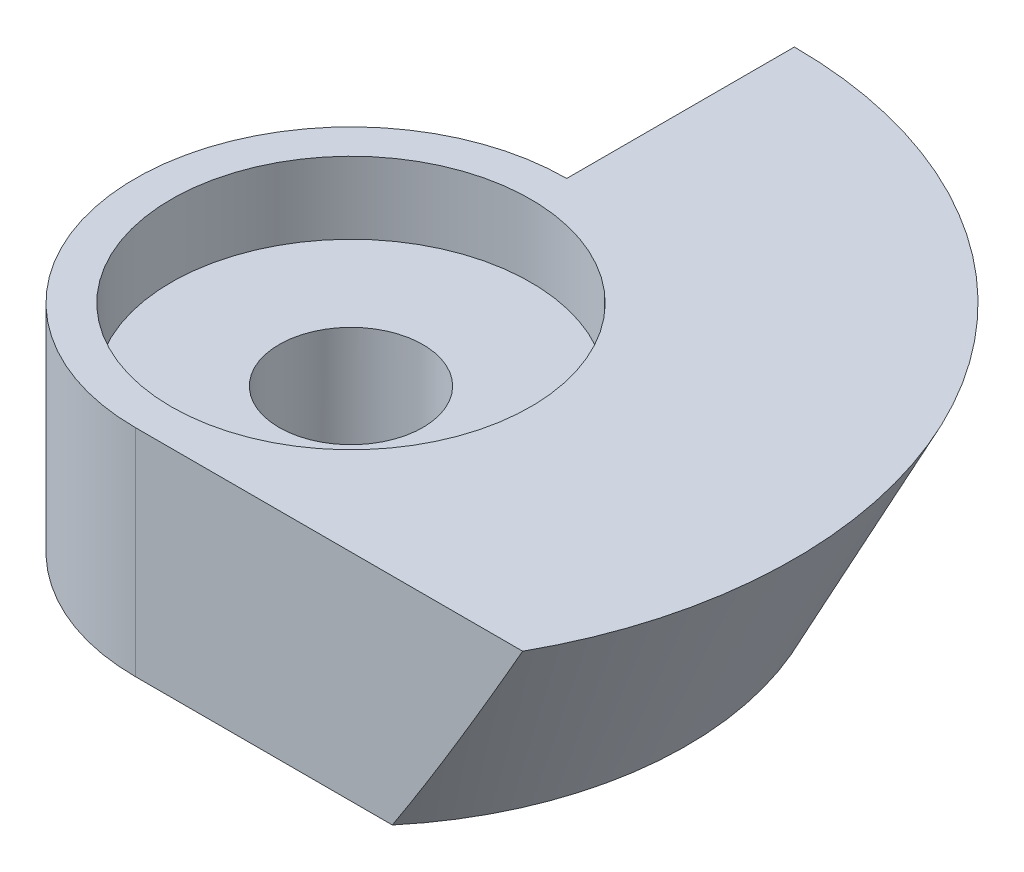
ISO-10303-21;
HEADER;
FILE_DESCRIPTION(('STEP AP214'),'2;1');
FILE_NAME('part.step','',(''),(''),'','','');
FILE_SCHEMA(('AUTOMOTIVE_DESIGN { 1 0 10303 214 1 1 1 1 }'));
ENDSEC;
DATA;
#1=APPLICATION_CONTEXT('core data for automotive mechanical design processes');
#2=APPLICATION_PROTOCOL_DEFINITION('international standard','automotive_design',2000,#1);
#3=PRODUCT_CONTEXT('',#1,'mechanical');
#4=PRODUCT('Part','Part','',(#3));
#5=PRODUCT_RELATED_PRODUCT_CATEGORY('part','',(#4));
#6=PRODUCT_DEFINITION_FORMATION('','',#4);
#7=PRODUCT_DEFINITION_CONTEXT('part definition',#1,'design');
#8=PRODUCT_DEFINITION('design','',#6,#7);
#9=PRODUCT_DEFINITION_SHAPE('','',#8);
#10=(LENGTH_UNIT() NAMED_UNIT(*) SI_UNIT(.MILLI.,.METRE.));
#11=(NAMED_UNIT(*) PLANE_ANGLE_UNIT() SI_UNIT($,.RADIAN.));
#12=(NAMED_UNIT(*) SI_UNIT($,.STERADIAN.) SOLID_ANGLE_UNIT());
#13=UNCERTAINTY_MEASURE_WITH_UNIT(LENGTH_MEASURE(1.E-05),#10,'distance_accuracy_value','');
#14=(GEOMETRIC_REPRESENTATION_CONTEXT(3) GLOBAL_UNCERTAINTY_ASSIGNED_CONTEXT((#13)) GLOBAL_UNIT_ASSIGNED_CONTEXT((#10,
#11,#12)) REPRESENTATION_CONTEXT('',''));
#15=CARTESIAN_POINT('',(0.,0.,0.));
#16=DIRECTION('',(0.,0.,1.));
#17=DIRECTION('',(1.,0.,0.));
#18=AXIS2_PLACEMENT_3D('',#15,#16,#17);
#19=CARTESIAN_POINT('',(-34.,-2.,0.));
#20=DIRECTION('',(0.,1.,0.));
#21=DIRECTION('',(0.,0.,1.));
#22=AXIS2_PLACEMENT_3D('',#19,#20,#21);
#23=CYLINDRICAL_SURFACE('',#22,3.);
#24=CARTESIAN_POINT('',(-34.,0.,0.));
#25=DIRECTION('',(0.,-1.,0.));
#26=DIRECTION('',(0.,0.,-1.));
#27=AXIS2_PLACEMENT_3D('',#24,#25,#26);
#28=CIRCLE('',#27,3.);
#29=CARTESIAN_POINT('',(-34.,0.,-3.));
#30=VERTEX_POINT('',#29);
#31=EDGE_CURVE('E90',#30,#30,#28,.T.);
#32=ORIENTED_EDGE('',*,*,#31,.T.);
#33=EDGE_LOOP('',(#32));
#34=FACE_BOUND('',#33,.T.);
#35=CARTESIAN_POINT('',(-34.,6.,0.));
#36=DIRECTION('',(0.,1.,0.));
#37=DIRECTION('',(0.,0.,1.));
#38=AXIS2_PLACEMENT_3D('',#35,#36,#37);
#39=CIRCLE('',#38,3.);
#40=CARTESIAN_POINT('',(-34.,6.,3.));
#41=VERTEX_POINT('',#40);
#42=EDGE_CURVE('E37',#41,#41,#39,.F.);
#43=ORIENTED_EDGE('',*,*,#42,.F.);
#44=EDGE_LOOP('',(#43));
#45=FACE_BOUND('',#44,.T.);
#46=ADVANCED_FACE('F33',(#34,#45),#23,.F.);
#47=CARTESIAN_POINT('',(-34.,0.,0.));
#48=DIRECTION('',(0.,-1.,0.));
#49=DIRECTION('',(0.,0.,-1.));
#50=AXIS2_PLACEMENT_3D('',#47,#48,#49);
#51=PLANE('',#50);
#52=ORIENTED_EDGE('',*,*,#31,.F.);
#53=EDGE_LOOP('',(#52));
#54=FACE_BOUND('',#53,.T.);
#55=DIRECTION('',(1.,0.,0.));
#56=VECTOR('',#55,1.);
#57=CARTESIAN_POINT('',(-34.,0.,9.00000000000001));
#58=LINE('',#57,#56);
#59=CARTESIAN_POINT('',(-34.,0.,9.00000000000001));
#60=VERTEX_POINT('',#59);
#61=CARTESIAN_POINT('',(-23.2761947052364,0.,9.00000000000001));
#62=VERTEX_POINT('',#61);
#63=EDGE_CURVE('E57',#60,#62,#58,.T.);
#64=ORIENTED_EDGE('',*,*,#63,.F.);
#65=CARTESIAN_POINT('',(-34.,0.,0.));
#66=DIRECTION('',(0.,-1.,0.));
#67=DIRECTION('',(0.,0.,-1.));
#68=AXIS2_PLACEMENT_3D('',#65,#66,#67);
#69=CIRCLE('',#68,9.);
#70=CARTESIAN_POINT('',(-34.,0.,-9.));
#71=VERTEX_POINT('',#70);
#72=EDGE_CURVE('E77',#71,#60,#69,.F.);
#73=ORIENTED_EDGE('',*,*,#72,.F.);
#74=DIRECTION('',(0.,0.,1.));
#75=VECTOR('',#74,1.);
#76=CARTESIAN_POINT('',(-34.,0.,0.));
#77=LINE('',#76,#75);
#78=CARTESIAN_POINT('',(-34.,0.,-14.));
#79=VERTEX_POINT('',#78);
#80=EDGE_CURVE('E99',#79,#71,#77,.T.);
#81=ORIENTED_EDGE('',*,*,#80,.F.);
#82=CARTESIAN_POINT('',(-34.,0.,0.));
#83=DIRECTION('',(0.,-1.,0.));
#84=DIRECTION('',(0.,0.,-1.));
#85=AXIS2_PLACEMENT_3D('',#82,#83,#84);
#86=CIRCLE('',#85,14.);
#87=EDGE_CURVE('E42',#79,#62,#86,.T.);
#88=ORIENTED_EDGE('',*,*,#87,.T.);
#89=EDGE_LOOP('',(#64,#73,#81,#88));
#90=FACE_BOUND('',#89,.T.);
#91=ADVANCED_FACE('F35',(#54,#90),#51,.T.);
#92=CARTESIAN_POINT('',(-34.,0.,0.));
#93=DIRECTION('',(0.,1.,0.));
#94=DIRECTION('',(0.,0.,1.));
#95=AXIS2_PLACEMENT_3D('',#92,#93,#94);
#96=CONICAL_SURFACE('',#95,14.,0.463647609000806);
#97=CARTESIAN_POINT('',(-46.05124263342,2.082051061027,9.00000000000001));
#98=CARTESIAN_POINT('',(-45.8418051737676,1.74647778440443,9.00000000000001));
#99=CARTESIAN_POINT('',(-45.6309921241656,1.41175580696632,9.00000000000001));
#100=CARTESIAN_POINT('',(-45.2061097794136,0.744352153815646,9.00000000000001));
#101=CARTESIAN_POINT('',(-44.9920402502802,0.411670627145565,9.00000000000001));
#102=CARTESIAN_POINT('',(-44.5595931486075,-0.252151320341726,9.00000000000001));
#103=CARTESIAN_POINT('',(-44.3412055955063,-0.583285250384705,9.00000000000001));
#104=CARTESIAN_POINT('',(-43.9000476576624,-1.2426126988821,9.00000000000001));
#105=CARTESIAN_POINT('',(-43.6772773819428,-1.57080629018444,9.00000000000001));
#106=CARTESIAN_POINT('',(-43.2118706895413,-2.24491219360758,9.00000000000001));
#107=CARTESIAN_POINT('',(-42.968885982482,-2.59058466598029,9.00000000000001));
#108=CARTESIAN_POINT('',(-42.4758451150317,-3.27684536002181,9.00000000000001));
#109=CARTESIAN_POINT('',(-42.2257891995151,-3.6174337571286,9.00000000000001));
#110=CARTESIAN_POINT('',(-41.7173181348371,-4.29170758895674,9.00000000000001));
#111=CARTESIAN_POINT('',(-41.4589132712517,-4.62540074499735,9.00000000000001));
#112=CARTESIAN_POINT('',(-40.931418565917,-5.2841815825682,9.00000000000001));
#113=CARTESIAN_POINT('',(-40.6623304023776,-5.60927060243106,9.00000000000001));
#114=CARTESIAN_POINT('',(-40.114252574345,-6.24365394102159,9.00000000000001));
#115=CARTESIAN_POINT('',(-39.8354410268634,-6.55310033119076,9.00000000000001));
#116=CARTESIAN_POINT('',(-39.404424670339,-7.00543598789603,9.00000000000001));
#117=CARTESIAN_POINT('',(-39.2585219489401,-7.15433366601658,9.00000000000001));
#118=CARTESIAN_POINT('',(-38.9618976077592,-7.44726173113909,9.00000000000001));
#119=CARTESIAN_POINT('',(-38.8111761378386,-7.59129226922149,9.00000000000001));
#120=CARTESIAN_POINT('',(-38.5064692191541,-7.87139104368516,9.00000000000001));
#121=CARTESIAN_POINT('',(-38.3525620058534,-8.00754406128876,9.00000000000001));
#122=CARTESIAN_POINT('',(-38.0386942313773,-8.27277914074999,9.00000000000001));
#123=CARTESIAN_POINT('',(-37.8787326894771,-8.40186004865441,9.00000000000001));
#124=CARTESIAN_POINT('',(-37.5523766433106,-8.65092511753133,9.00000000000001));
#125=CARTESIAN_POINT('',(-37.3859965320914,-8.77092802702211,9.00000000000001));
#126=CARTESIAN_POINT('',(-37.0458230584429,-8.99985261237219,9.00000000000001));
#127=CARTESIAN_POINT('',(-36.8720335963641,-9.10878001870419,9.00000000000001));
#128=CARTESIAN_POINT('',(-36.5605749181766,-9.28742021918038,9.00000000000001));
#129=CARTESIAN_POINT('',(-36.4246438377588,-9.36015663216481,9.00000000000001));
#130=CARTESIAN_POINT('',(-36.1481449410307,-9.49631649116809,9.00000000000001));
#131=CARTESIAN_POINT('',(-36.0075768473842,-9.55973937891067,9.00000000000001));
#132=CARTESIAN_POINT('',(-35.7222265773906,-9.67552569790647,9.00000000000001));
#133=CARTESIAN_POINT('',(-35.5774527298446,-9.72790949015109,9.00000000000001));
#134=CARTESIAN_POINT('',(-35.2839550681397,-9.8200587659661,9.00000000000001));
#135=CARTESIAN_POINT('',(-35.135232826158,-9.85982919264216,9.00000000000001));
#136=CARTESIAN_POINT('',(-34.858073338951,-9.92013589673058,9.00000000000001));
#137=CARTESIAN_POINT('',(-34.7300777624977,-9.94270138445147,9.00000000000001));
#138=CARTESIAN_POINT('',(-34.4726423367027,-9.97702502264165,9.00000000000001));
#139=CARTESIAN_POINT('',(-34.3432026467076,-9.98878435377838,9.00000000000001));
#140=CARTESIAN_POINT('',(-34.08372369976,-10.0010911758163,9.00000000000001));
#141=CARTESIAN_POINT('',(-33.9536841803814,-10.0016331768157,9.00000000000001));
#142=CARTESIAN_POINT('',(-33.6940448817707,-9.99147332689007,9.00000000000001));
#143=CARTESIAN_POINT('',(-33.5644451201461,-9.98077103095955,9.00000000000001));
#144=CARTESIAN_POINT('',(-33.3070921385899,-9.94855235077597,9.00000000000001));
#145=CARTESIAN_POINT('',(-33.1793338627076,-9.92707610022198,9.00000000000001));
#146=CARTESIAN_POINT('',(-32.92591243172,-9.87402382913864,9.00000000000001));
#147=CARTESIAN_POINT('',(-32.8002501590582,-9.84244366229594,9.00000000000001));
#148=CARTESIAN_POINT('',(-32.4274307710317,-9.73389498537744,9.00000000000001));
#149=CARTESIAN_POINT('',(-32.1842312903593,-9.64308961834335,9.00000000000001));
#150=CARTESIAN_POINT('',(-31.7393795275111,-9.44532728846524,9.00000000000001));
#151=CARTESIAN_POINT('',(-31.5362359760544,-9.3415986973749,9.00000000000001));
#152=CARTESIAN_POINT('',(-31.1397306932985,-9.11667353735228,9.00000000000001));
#153=CARTESIAN_POINT('',(-30.946377074036,-8.99546279250116,9.00000000000001));
#154=CARTESIAN_POINT('',(-30.5680181776564,-8.73898779165434,9.00000000000001));
#155=CARTESIAN_POINT('',(-30.3830556924628,-8.60366107368573,9.00000000000001));
#156=CARTESIAN_POINT('',(-30.1118748855732,-8.39279654805537,9.00000000000001));
#157=CARTESIAN_POINT('',(-30.0225402243289,-8.32120921167293,9.00000000000001));
#158=CARTESIAN_POINT('',(-29.8458050706926,-8.17568669573227,9.00000000000001));
#159=CARTESIAN_POINT('',(-29.7584045472328,-8.10175155393304,9.00000000000001));
#160=CARTESIAN_POINT('',(-29.490130426298,-7.86922254446967,9.00000000000001));
#161=CARTESIAN_POINT('',(-29.3123299217795,-7.7070752100221,9.00000000000001));
#162=CARTESIAN_POINT('',(-28.9635775339928,-7.37554580216417,9.00000000000001));
#163=CARTESIAN_POINT('',(-28.7926274245331,-7.20616187810628,9.00000000000001));
#164=CARTESIAN_POINT('',(-28.4565209727252,-6.86147304778311,9.00000000000001));
#165=CARTESIAN_POINT('',(-28.2913697499922,-6.68616316500284,9.00000000000001));
#166=CARTESIAN_POINT('',(-27.9662000717485,-6.33083245006463,9.00000000000001));
#167=CARTESIAN_POINT('',(-27.8061821031208,-6.1508111739599,9.00000000000001));
#168=CARTESIAN_POINT('',(-27.4900653862954,-5.7862643821218,9.00000000000001));
#169=CARTESIAN_POINT('',(-27.3339823017993,-5.60172531568982,9.00000000000001));
#170=CARTESIAN_POINT('',(-27.0257448586162,-5.22938967972377,9.00000000000001));
#171=CARTESIAN_POINT('',(-26.873590677661,-5.04159296346356,9.00000000000001));
#172=CARTESIAN_POINT('',(-26.4224397967054,-4.47430717975398,9.00000000000001));
#173=CARTESIAN_POINT('',(-26.1285859494027,-4.09072534023988,9.00000000000001));
#174=CARTESIAN_POINT('',(-25.5479707804581,-3.31072339664814,9.00000000000001));
#175=CARTESIAN_POINT('',(-25.2613462082285,-2.91420226901157,9.00000000000001));
#176=CARTESIAN_POINT('',(-24.6968392806286,-2.11494053456859,9.00000000000001));
#177=CARTESIAN_POINT('',(-24.4189578265672,-1.71219929288303,9.00000000000001));
#178=CARTESIAN_POINT('',(-23.8709127643292,-0.902814015668781,9.00000000000001));
#179=CARTESIAN_POINT('',(-23.6007334264781,-0.496180599009647,9.00000000000001));
#180=CARTESIAN_POINT('',(-23.0662125743692,0.320877389166775,9.00000000000001));
#181=CARTESIAN_POINT('',(-22.8018708544045,0.731301826370288,9.00000000000001));
#182=CARTESIAN_POINT('',(-22.2774251541367,1.55621557914998,9.00000000000001));
#183=CARTESIAN_POINT('',(-22.017332744564,1.97071223955201,9.00000000000001));
#184=CARTESIAN_POINT('',(-21.5012714478924,2.80226664694878,9.00000000000001));
#185=CARTESIAN_POINT('',(-21.2453026031377,3.21932442018247,9.00000000000001));
#186=CARTESIAN_POINT('',(-20.4826162779848,4.47372003268317,9.00000000000001));
#187=CARTESIAN_POINT('',(-19.9811409275276,5.31424543267345,9.00000000000001));
#188=CARTESIAN_POINT('',(-18.9880654528852,7.0022819589798,9.00000000000001));
#189=CARTESIAN_POINT('',(-18.4964763400686,7.84979953631449,9.00000000000001));
#190=CARTESIAN_POINT('',(-17.5213099173667,9.54943740392245,9.00000000000001));
#191=CARTESIAN_POINT('',(-17.0377326914861,10.4015577423316,9.00000000000001));
#192=CARTESIAN_POINT('',(-16.100445663777,12.0674548468962,9.00000000000001));
#193=CARTESIAN_POINT('',(-15.6464343125674,12.8810622259291,9.00000000000001));
#194=CARTESIAN_POINT('',(-14.7430287560107,14.5108435745914,9.00000000000001));
#195=CARTESIAN_POINT('',(-14.2936345904027,15.3270175662322,9.00000000000001));
#196=CARTESIAN_POINT('',(-13.3992976545786,16.9602343141236,9.00000000000001));
#197=CARTESIAN_POINT('',(-12.9543492961203,17.7772740131035,9.00000000000001));
#198=CARTESIAN_POINT('',(-12.0676375485481,19.4130605656417,9.00000000000001));
#199=CARTESIAN_POINT('',(-11.6258740998917,20.231807386914,9.00000000000001));
#200=CARTESIAN_POINT('',(-11.1853971989285,21.0512426334199,9.00000000000001));
#201=B_SPLINE_CURVE_WITH_KNOTS('',3,(#97,#98,#99,#100,#101,#102,#103,#104,#105,#106,#107,#108,
#109,#110,#111,#112,#113,#114,#115,#116,#117,#118,#119,#120,#121,#122,#123,#124,#125,#126,#127,
#128,#129,#130,#131,#132,#133,#134,#135,#136,#137,#138,#139,#140,#141,#142,#143,#144,#145,#146,
#147,#148,#149,#150,#151,#152,#153,#154,#155,#156,#157,#158,#159,#160,#161,#162,#163,#164,#165,
#166,#167,#168,#169,#170,#171,#172,#173,#174,#175,#176,#177,#178,#179,#180,#181,#182,#183,#184,
#185,#186,#187,#188,#189,#190,#191,#192,#193,#194,#195,#196,#197,#198,#199,#200),.UNSPECIFIED.,
.F.,.F.,(4,2,2,2,2,2,2,2,2,2,2,2,2,2,2,2,2,2,2,2,2,2,2,2,2,2,2,2,2,2,2,2,2,2,2,2,2,2,2,2,2,2,2,
2,2,2,2,2,2,2,2,4),(0.,1.18670763549024,2.37350094436255,3.56346455379613,4.75339859947634,
6.02091332043228,7.2883842012246,8.55434905884636,9.82011583038283,11.0691349554468,
11.6944449852806,12.3197355870621,12.9360236023707,13.552411879473,14.1674902729323,
14.7822487874527,15.2444587315032,15.7066963702871,16.1680738276734,16.6292702498162,
17.0187533852593,17.4081939611904,17.7978251297068,18.1874717188877,18.5756775078576,
18.9640428084259,19.7401448551167,20.4234712859044,21.1073549601768,21.7944046244453,
22.1378090076447,22.481207870778,23.2028274148444,23.9246326199043,24.6470598271736,
25.3695553544148,26.094577638747,26.8196326636679,28.2689646208415,29.7366311994741,
31.2044485841882,32.6690152071413,34.1335301388274,35.6015273042044,37.0695395345858,
40.0056871911681,42.9449418412034,45.8842272898462,48.6793394303408,51.4744756075674,
54.2654888272467,57.0564497323441),.UNSPECIFIED.);
#202=CARTESIAN_POINT('',(-17.8367701247554,9.,9.00000000000001));
#203=VERTEX_POINT('',#202);
#204=EDGE_CURVE('E83',#62,#203,#201,.T.);
#205=ORIENTED_EDGE('',*,*,#204,.F.);
#206=ORIENTED_EDGE('',*,*,#87,.F.);
#207=DIRECTION('',(0.,0.894427190999916,-0.447213595499958));
#208=VECTOR('',#207,1.);
#209=CARTESIAN_POINT('',(-34.,-28.,0.));
#210=LINE('',#209,#208);
#211=CARTESIAN_POINT('',(-34.,9.,-18.5));
#212=VERTEX_POINT('',#211);
#213=EDGE_CURVE('E78',#212,#79,#210,.F.);
#214=ORIENTED_EDGE('',*,*,#213,.F.);
#215=CARTESIAN_POINT('',(-34.,9.,0.));
#216=DIRECTION('',(0.,-1.,0.));
#217=DIRECTION('',(0.,0.,-1.));
#218=AXIS2_PLACEMENT_3D('',#215,#216,#217);
#219=CIRCLE('',#218,18.5);
#220=EDGE_CURVE('E206',#212,#203,#219,.T.);
#221=ORIENTED_EDGE('',*,*,#220,.T.);
#222=EDGE_LOOP('',(#205,#206,#214,#221));
#223=FACE_BOUND('',#222,.T.);
#224=ADVANCED_FACE('F107',(#223),#96,.T.);
#225=CARTESIAN_POINT('',(-15.5,9.,0.));
#226=DIRECTION('',(0.,1.,0.));
#227=DIRECTION('',(0.,0.,1.));
#228=AXIS2_PLACEMENT_3D('',#225,#226,#227);
#229=PLANE('',#228);
#230=CARTESIAN_POINT('',(-34.,9.,0.));
#231=DIRECTION('',(0.,1.,0.));
#232=DIRECTION('',(0.,0.,1.));
#233=AXIS2_PLACEMENT_3D('',#230,#231,#232);
#234=CIRCLE('',#233,7.5);
#235=CARTESIAN_POINT('',(-34.,9.,7.5));
#236=VERTEX_POINT('',#235);
#237=EDGE_CURVE('E141',#236,#236,#234,.T.);
#238=ORIENTED_EDGE('',*,*,#237,.F.);
#239=EDGE_LOOP('',(#238));
#240=FACE_BOUND('',#239,.T.);
#241=DIRECTION('',(-1.,0.,0.));
#242=VECTOR('',#241,1.);
#243=CARTESIAN_POINT('',(-15.5,9.,9.00000000000001));
#244=LINE('',#243,#242);
#245=CARTESIAN_POINT('',(-34.,9.,9.00000000000001));
#246=VERTEX_POINT('',#245);
#247=EDGE_CURVE('E11',#203,#246,#244,.T.);
#248=ORIENTED_EDGE('',*,*,#247,.F.);
#249=ORIENTED_EDGE('',*,*,#220,.F.);
#250=DIRECTION('',(0.,0.,-1.));
#251=VECTOR('',#250,1.);
#252=CARTESIAN_POINT('',(-34.,9.,-20.4718585616774));
#253=LINE('',#252,#251);
#254=CARTESIAN_POINT('',(-34.,9.,-9.));
#255=VERTEX_POINT('',#254);
#256=EDGE_CURVE('E89',#255,#212,#253,.T.);
#257=ORIENTED_EDGE('',*,*,#256,.F.);
#258=CARTESIAN_POINT('',(-34.,9.,0.));
#259=DIRECTION('',(0.,-1.,0.));
#260=DIRECTION('',(0.,0.,1.));
#261=AXIS2_PLACEMENT_3D('',#258,#259,#260);
#262=CIRCLE('',#261,9.);
#263=EDGE_CURVE('E49',#246,#255,#262,.T.);
#264=ORIENTED_EDGE('',*,*,#263,.F.);
#265=EDGE_LOOP('',(#248,#249,#257,#264));
#266=FACE_BOUND('',#265,.T.);
#267=ADVANCED_FACE('F88',(#240,#266),#229,.T.);
#268=CARTESIAN_POINT('',(-34.,-2.,0.));
#269=DIRECTION('',(0.,1.,0.));
#270=DIRECTION('',(0.,0.,1.));
#271=AXIS2_PLACEMENT_3D('',#268,#269,#270);
#272=CYLINDRICAL_SURFACE('',#271,9.);
#273=ORIENTED_EDGE('',*,*,#72,.T.);
#274=DIRECTION('',(0.,1.,0.));
#275=VECTOR('',#274,1.);
#276=CARTESIAN_POINT('',(-34.,-2.,9.00000000000001));
#277=LINE('',#276,#275);
#278=EDGE_CURVE('E74',#60,#246,#277,.T.);
#279=ORIENTED_EDGE('',*,*,#278,.T.);
#280=ORIENTED_EDGE('',*,*,#263,.T.);
#281=DIRECTION('',(0.,1.,0.));
#282=VECTOR('',#281,1.);
#283=CARTESIAN_POINT('',(-34.,-2.,-9.));
#284=LINE('',#283,#282);
#285=EDGE_CURVE('E79',#71,#255,#284,.T.);
#286=ORIENTED_EDGE('',*,*,#285,.F.);
#287=EDGE_LOOP('',(#273,#279,#280,#286));
#288=FACE_BOUND('',#287,.T.);
#289=ADVANCED_FACE('F75',(#288),#272,.T.);
#290=CARTESIAN_POINT('',(-34.,-2.,9.00000000000001));
#291=DIRECTION('',(0.,0.,-1.));
#292=DIRECTION('',(-1.,0.,0.));
#293=AXIS2_PLACEMENT_3D('',#290,#291,#292);
#294=PLANE('',#293);
#295=ORIENTED_EDGE('',*,*,#63,.T.);
#296=ORIENTED_EDGE('',*,*,#204,.T.);
#297=ORIENTED_EDGE('',*,*,#247,.T.);
#298=ORIENTED_EDGE('',*,*,#278,.F.);
#299=EDGE_LOOP('',(#295,#296,#297,#298));
#300=FACE_BOUND('',#299,.T.);
#301=ADVANCED_FACE('F82',(#300),#294,.F.);
#302=CARTESIAN_POINT('',(-34.,-2.,-20.4718585616774));
#303=DIRECTION('',(1.,0.,0.));
#304=DIRECTION('',(0.,0.,-1.));
#305=AXIS2_PLACEMENT_3D('',#302,#303,#304);
#306=PLANE('',#305);
#307=ORIENTED_EDGE('',*,*,#80,.T.);
#308=ORIENTED_EDGE('',*,*,#285,.T.);
#309=ORIENTED_EDGE('',*,*,#256,.T.);
#310=ORIENTED_EDGE('',*,*,#213,.T.);
#311=EDGE_LOOP('',(#307,#308,#309,#310));
#312=FACE_BOUND('',#311,.T.);
#313=ADVANCED_FACE('F114',(#312),#306,.F.);
#314=CARTESIAN_POINT('',(-34.,6.,0.));
#315=DIRECTION('',(0.,1.,0.));
#316=DIRECTION('',(0.,0.,1.));
#317=AXIS2_PLACEMENT_3D('',#314,#315,#316);
#318=PLANE('',#317);
#319=CARTESIAN_POINT('',(-34.,6.,0.));
#320=DIRECTION('',(0.,1.,0.));
#321=DIRECTION('',(0.,0.,1.));
#322=AXIS2_PLACEMENT_3D('',#319,#320,#321);
#323=CIRCLE('',#322,7.5);
#324=CARTESIAN_POINT('',(-34.,6.,7.5));
#325=VERTEX_POINT('',#324);
#326=EDGE_CURVE('E139',#325,#325,#323,.T.);
#327=ORIENTED_EDGE('',*,*,#326,.T.);
#328=EDGE_LOOP('',(#327));
#329=FACE_BOUND('',#328,.T.);
#330=ORIENTED_EDGE('',*,*,#42,.T.);
#331=EDGE_LOOP('',(#330));
#332=FACE_BOUND('',#331,.T.);
#333=ADVANCED_FACE('F118',(#329,#332),#318,.T.);
#334=CARTESIAN_POINT('',(-34.,6.,0.));
#335=DIRECTION('',(0.,1.,0.));
#336=DIRECTION('',(0.,0.,1.));
#337=AXIS2_PLACEMENT_3D('',#334,#335,#336);
#338=CYLINDRICAL_SURFACE('',#337,7.5);
#339=ORIENTED_EDGE('',*,*,#326,.F.);
#340=EDGE_LOOP('',(#339));
#341=FACE_BOUND('',#340,.T.);
#342=ORIENTED_EDGE('',*,*,#237,.T.);
#343=EDGE_LOOP('',(#342));
#344=FACE_BOUND('',#343,.T.);
#345=ADVANCED_FACE('F147',(#341,#344),#338,.F.);
#346=CLOSED_SHELL('',(#46,#91,#224,#267,#289,#301,#313,#333,#345));
#347=MANIFOLD_SOLID_BREP('B2',#346);
#348=ADVANCED_BREP_SHAPE_REPRESENTATION('',(#18,#347),#14);
#349=SHAPE_DEFINITION_REPRESENTATION(#9,#348);
ENDSEC;
END-ISO-10303-21;
